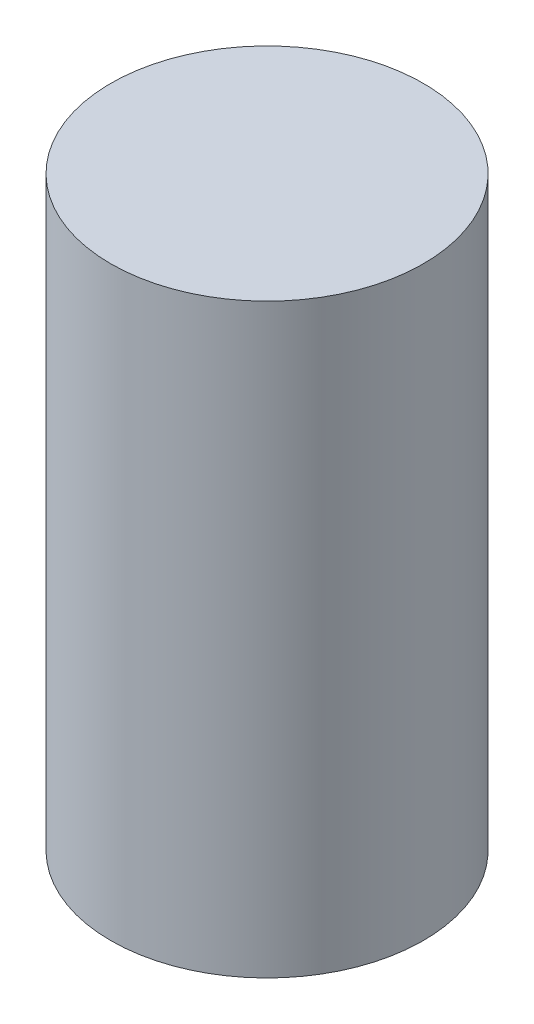
ISO-10303-21;
HEADER;
FILE_DESCRIPTION(('STEP AP214'),'2;1');
FILE_NAME('part.step','',(''),(''),'','','');
FILE_SCHEMA(('AUTOMOTIVE_DESIGN { 1 0 10303 214 1 1 1 1 }'));
ENDSEC;
DATA;
#1=APPLICATION_CONTEXT('core data for automotive mechanical design processes');
#2=APPLICATION_PROTOCOL_DEFINITION('international standard','automotive_design',2000,#1);
#3=PRODUCT_CONTEXT('',#1,'mechanical');
#4=PRODUCT('Part','Part','',(#3));
#5=PRODUCT_RELATED_PRODUCT_CATEGORY('part','',(#4));
#6=PRODUCT_DEFINITION_FORMATION('','',#4);
#7=PRODUCT_DEFINITION_CONTEXT('part definition',#1,'design');
#8=PRODUCT_DEFINITION('design','',#6,#7);
#9=PRODUCT_DEFINITION_SHAPE('','',#8);
#10=(LENGTH_UNIT() NAMED_UNIT(*) SI_UNIT(.MILLI.,.METRE.));
#11=(NAMED_UNIT(*) PLANE_ANGLE_UNIT() SI_UNIT($,.RADIAN.));
#12=(NAMED_UNIT(*) SI_UNIT($,.STERADIAN.) SOLID_ANGLE_UNIT());
#13=UNCERTAINTY_MEASURE_WITH_UNIT(LENGTH_MEASURE(1.E-05),#10,'distance_accuracy_value','');
#14=(GEOMETRIC_REPRESENTATION_CONTEXT(3) GLOBAL_UNCERTAINTY_ASSIGNED_CONTEXT((#13)) GLOBAL_UNIT_ASSIGNED_CONTEXT((#10,
#11,#12)) REPRESENTATION_CONTEXT('',''));
#15=CARTESIAN_POINT('',(0.,0.,0.));
#16=DIRECTION('',(0.,0.,1.));
#17=DIRECTION('',(1.,0.,0.));
#18=AXIS2_PLACEMENT_3D('',#15,#16,#17);
#19=CARTESIAN_POINT('',(0.,150.,0.));
#20=DIRECTION('',(0.,-1.,0.));
#21=DIRECTION('',(0.,0.,-1.));
#22=AXIS2_PLACEMENT_3D('',#19,#20,#21);
#23=CYLINDRICAL_SURFACE('',#22,40.);
#24=CARTESIAN_POINT('',(0.,150.,0.));
#25=DIRECTION('',(0.,1.,0.));
#26=DIRECTION('',(0.,0.,1.));
#27=AXIS2_PLACEMENT_3D('',#24,#25,#26);
#28=CIRCLE('',#27,40.);
#29=CARTESIAN_POINT('',(0.,150.,40.));
#30=VERTEX_POINT('',#29);
#31=EDGE_CURVE('E10',#30,#30,#28,.T.);
#32=ORIENTED_EDGE('',*,*,#31,.F.);
#33=EDGE_LOOP('',(#32));
#34=FACE_BOUND('',#33,.T.);
#35=CARTESIAN_POINT('',(0.,0.,0.));
#36=DIRECTION('',(0.,1.,0.));
#37=DIRECTION('',(0.,0.,1.));
#38=AXIS2_PLACEMENT_3D('',#35,#36,#37);
#39=CIRCLE('',#38,40.);
#40=CARTESIAN_POINT('',(0.,0.,40.));
#41=VERTEX_POINT('',#40);
#42=EDGE_CURVE('E31',#41,#41,#39,.T.);
#43=ORIENTED_EDGE('',*,*,#42,.T.);
#44=EDGE_LOOP('',(#43));
#45=FACE_BOUND('',#44,.T.);
#46=ADVANCED_FACE('F28',(#34,#45),#23,.T.);
#47=CARTESIAN_POINT('',(0.,150.,0.));
#48=DIRECTION('',(0.,1.,0.));
#49=DIRECTION('',(0.,0.,1.));
#50=AXIS2_PLACEMENT_3D('',#47,#48,#49);
#51=PLANE('',#50);
#52=ORIENTED_EDGE('',*,*,#31,.T.);
#53=EDGE_LOOP('',(#52));
#54=FACE_BOUND('',#53,.T.);
#55=ADVANCED_FACE('F43',(#54),#51,.T.);
#56=CARTESIAN_POINT('',(0.,0.,0.));
#57=DIRECTION('',(0.,1.,0.));
#58=DIRECTION('',(0.,0.,1.));
#59=AXIS2_PLACEMENT_3D('',#56,#57,#58);
#60=PLANE('',#59);
#61=ORIENTED_EDGE('',*,*,#42,.F.);
#62=EDGE_LOOP('',(#61));
#63=FACE_BOUND('',#62,.T.);
#64=ADVANCED_FACE('F41',(#63),#60,.F.);
#65=CLOSED_SHELL('',(#46,#55,#64));
#66=MANIFOLD_SOLID_BREP('B2',#65);
#67=ADVANCED_BREP_SHAPE_REPRESENTATION('',(#18,#66),#14);
#68=SHAPE_DEFINITION_REPRESENTATION(#9,#67);
ENDSEC;
END-ISO-10303-21;
